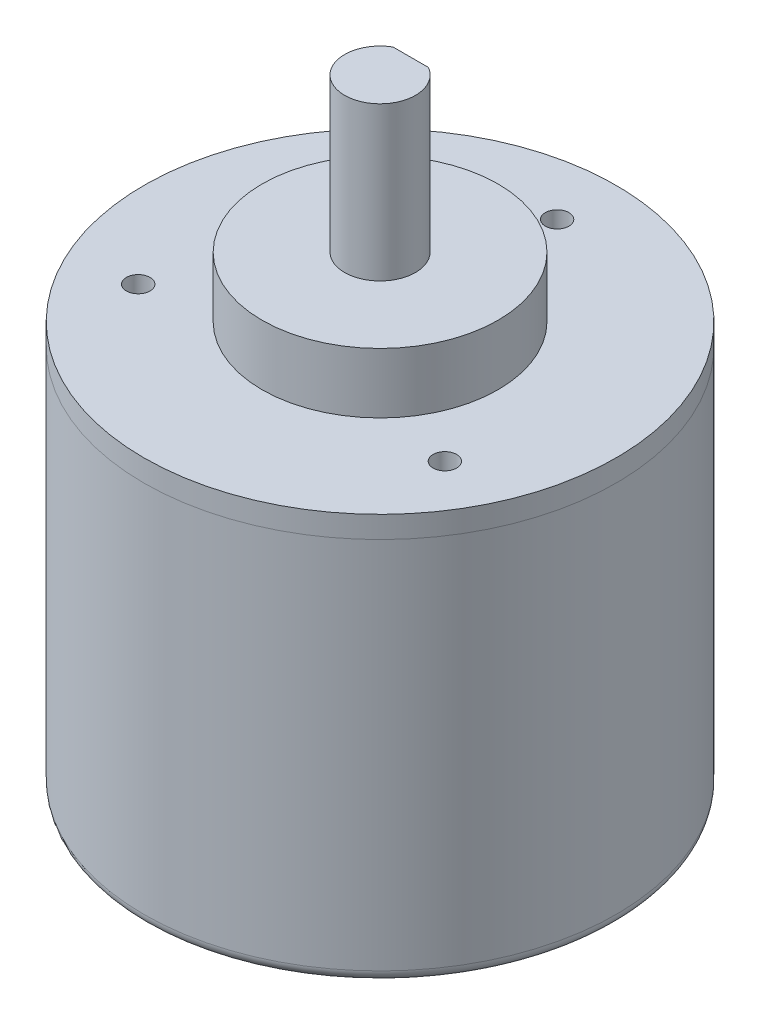
ISO-10303-21;
HEADER;
FILE_DESCRIPTION(('STEP AP214'),'2;1');
FILE_NAME('part.step','',(''),(''),'','','');
FILE_SCHEMA(('AUTOMOTIVE_DESIGN { 1 0 10303 214 1 1 1 1 }'));
ENDSEC;
DATA;
#1=APPLICATION_CONTEXT('core data for automotive mechanical design processes');
#2=APPLICATION_PROTOCOL_DEFINITION('international standard','automotive_design',2000,#1);
#3=PRODUCT_CONTEXT('',#1,'mechanical');
#4=PRODUCT('Part','Part','',(#3));
#5=PRODUCT_RELATED_PRODUCT_CATEGORY('part','',(#4));
#6=PRODUCT_DEFINITION_FORMATION('','',#4);
#7=PRODUCT_DEFINITION_CONTEXT('part definition',#1,'design');
#8=PRODUCT_DEFINITION('design','',#6,#7);
#9=PRODUCT_DEFINITION_SHAPE('','',#8);
#10=(LENGTH_UNIT() NAMED_UNIT(*) SI_UNIT(.MILLI.,.METRE.));
#11=(NAMED_UNIT(*) PLANE_ANGLE_UNIT() SI_UNIT($,.RADIAN.));
#12=(NAMED_UNIT(*) SI_UNIT($,.STERADIAN.) SOLID_ANGLE_UNIT());
#13=UNCERTAINTY_MEASURE_WITH_UNIT(LENGTH_MEASURE(1.E-05),#10,'distance_accuracy_value','');
#14=(GEOMETRIC_REPRESENTATION_CONTEXT(3) GLOBAL_UNCERTAINTY_ASSIGNED_CONTEXT((#13)) GLOBAL_UNIT_ASSIGNED_CONTEXT((#10,
#11,#12)) REPRESENTATION_CONTEXT('',''));
#15=CARTESIAN_POINT('',(0.,0.,0.));
#16=DIRECTION('',(0.,0.,1.));
#17=DIRECTION('',(1.,0.,0.));
#18=AXIS2_PLACEMENT_3D('',#15,#16,#17);
#19=CARTESIAN_POINT('',(0.,39.6,0.));
#20=DIRECTION('',(0.,1.,0.));
#21=DIRECTION('',(0.,0.,1.));
#22=AXIS2_PLACEMENT_3D('',#19,#20,#21);
#23=PLANE('',#22);
#24=CARTESIAN_POINT('',(0.,39.6,0.));
#25=DIRECTION('',(0.,1.,0.));
#26=DIRECTION('',(0.,0.,1.));
#27=AXIS2_PLACEMENT_3D('',#24,#25,#26);
#28=CIRCLE('',#27,10.);
#29=CARTESIAN_POINT('',(0.,39.6,10.));
#30=VERTEX_POINT('',#29);
#31=EDGE_CURVE('E99',#30,#30,#28,.T.);
#32=ORIENTED_EDGE('',*,*,#31,.T.);
#33=EDGE_LOOP('',(#32));
#34=FACE_BOUND('',#33,.T.);
#35=DIRECTION('',(-1.,0.,0.));
#36=VECTOR('',#35,1.);
#37=CARTESIAN_POINT('',(-1.5,39.6,-2.59807621135332));
#38=LINE('',#37,#36);
#39=CARTESIAN_POINT('',(1.5,39.6,-2.59807621135332));
#40=VERTEX_POINT('',#39);
#41=CARTESIAN_POINT('',(-1.5,39.6,-2.59807621135332));
#42=VERTEX_POINT('',#41);
#43=EDGE_CURVE('E74',#40,#42,#38,.T.);
#44=ORIENTED_EDGE('',*,*,#43,.F.);
#45=CARTESIAN_POINT('',(0.,39.6,0.));
#46=DIRECTION('',(0.,1.,0.));
#47=DIRECTION('',(0.,0.,1.));
#48=AXIS2_PLACEMENT_3D('',#45,#46,#47);
#49=CIRCLE('',#48,3.);
#50=EDGE_CURVE('E59',#42,#40,#49,.T.);
#51=ORIENTED_EDGE('',*,*,#50,.F.);
#52=EDGE_LOOP('',(#44,#51));
#53=FACE_BOUND('',#52,.T.);
#54=ADVANCED_FACE('F42',(#34,#53),#23,.T.);
#55=CARTESIAN_POINT('',(0.,34.5,0.));
#56=DIRECTION('',(0.,1.,0.));
#57=DIRECTION('',(0.,0.,1.));
#58=AXIS2_PLACEMENT_3D('',#55,#56,#57);
#59=PLANE('',#58);
#60=CARTESIAN_POINT('',(0.,34.5,-15.));
#61=DIRECTION('',(0.,1.,0.));
#62=DIRECTION('',(0.,0.,1.));
#63=AXIS2_PLACEMENT_3D('',#60,#61,#62);
#64=CIRCLE('',#63,1.);
#65=CARTESIAN_POINT('',(0.,34.5,-14.));
#66=VERTEX_POINT('',#65);
#67=EDGE_CURVE('E90',#66,#66,#64,.T.);
#68=ORIENTED_EDGE('',*,*,#67,.F.);
#69=EDGE_LOOP('',(#68));
#70=FACE_BOUND('',#69,.T.);
#71=CARTESIAN_POINT('',(12.9903810567675,34.5,7.49999999999944));
#72=DIRECTION('',(0.,1.,0.));
#73=DIRECTION('',(0.,0.,1.));
#74=AXIS2_PLACEMENT_3D('',#71,#72,#73);
#75=CIRCLE('',#74,1.00000000000082);
#76=CARTESIAN_POINT('',(12.9903810567675,34.5,8.50000000000027));
#77=VERTEX_POINT('',#76);
#78=EDGE_CURVE('E94',#77,#77,#75,.T.);
#79=ORIENTED_EDGE('',*,*,#78,.F.);
#80=EDGE_LOOP('',(#79));
#81=FACE_BOUND('',#80,.T.);
#82=CARTESIAN_POINT('',(-12.9903810567656,34.5,7.50000000000056));
#83=DIRECTION('',(0.,1.,0.));
#84=DIRECTION('',(0.,0.,1.));
#85=AXIS2_PLACEMENT_3D('',#82,#83,#84);
#86=CIRCLE('',#85,1.00000000000122);
#87=CARTESIAN_POINT('',(-12.9903810567656,34.5,8.50000000000178));
#88=VERTEX_POINT('',#87);
#89=EDGE_CURVE('E89',#88,#88,#86,.T.);
#90=ORIENTED_EDGE('',*,*,#89,.F.);
#91=EDGE_LOOP('',(#90));
#92=FACE_BOUND('',#91,.T.);
#93=CARTESIAN_POINT('',(0.,34.5,0.));
#94=DIRECTION('',(0.,1.,0.));
#95=DIRECTION('',(0.,0.,1.));
#96=AXIS2_PLACEMENT_3D('',#93,#94,#95);
#97=CIRCLE('',#96,20.);
#98=CARTESIAN_POINT('',(0.,34.5,20.));
#99=VERTEX_POINT('',#98);
#100=EDGE_CURVE('E12',#99,#99,#97,.T.);
#101=ORIENTED_EDGE('',*,*,#100,.T.);
#102=EDGE_LOOP('',(#101));
#103=FACE_BOUND('',#102,.T.);
#104=CARTESIAN_POINT('',(0.,34.5,0.));
#105=DIRECTION('',(0.,1.,0.));
#106=DIRECTION('',(0.,0.,1.));
#107=AXIS2_PLACEMENT_3D('',#104,#105,#106);
#108=CIRCLE('',#107,10.);
#109=CARTESIAN_POINT('',(0.,34.5,10.));
#110=VERTEX_POINT('',#109);
#111=EDGE_CURVE('E102',#110,#110,#108,.T.);
#112=ORIENTED_EDGE('',*,*,#111,.F.);
#113=EDGE_LOOP('',(#112));
#114=FACE_BOUND('',#113,.T.);
#115=ADVANCED_FACE('F131',(#70,#81,#92,#103,#114),#59,.T.);
#116=CARTESIAN_POINT('',(0.,34.5,0.));
#117=DIRECTION('',(0.,-1.,0.));
#118=DIRECTION('',(0.,0.,-1.));
#119=AXIS2_PLACEMENT_3D('',#116,#117,#118);
#120=CYLINDRICAL_SURFACE('',#119,20.);
#121=ORIENTED_EDGE('',*,*,#100,.F.);
#122=EDGE_LOOP('',(#121));
#123=FACE_BOUND('',#122,.T.);
#124=CARTESIAN_POINT('',(0.,32.65,0.));
#125=DIRECTION('',(0.,1.,0.));
#126=DIRECTION('',(0.,0.,1.));
#127=AXIS2_PLACEMENT_3D('',#124,#125,#126);
#128=CIRCLE('',#127,20.);
#129=CARTESIAN_POINT('',(0.,32.65,20.));
#130=VERTEX_POINT('',#129);
#131=EDGE_CURVE('E51',#130,#130,#128,.T.);
#132=ORIENTED_EDGE('',*,*,#131,.T.);
#133=EDGE_LOOP('',(#132));
#134=FACE_BOUND('',#133,.T.);
#135=ADVANCED_FACE('F44',(#123,#134),#120,.T.);
#136=CARTESIAN_POINT('',(0.,32.65,0.));
#137=DIRECTION('',(0.,1.,0.));
#138=DIRECTION('',(0.,0.,1.));
#139=AXIS2_PLACEMENT_3D('',#136,#137,#138);
#140=PLANE('',#139);
#141=CARTESIAN_POINT('',(0.,32.65,-15.));
#142=DIRECTION('',(0.,1.,0.));
#143=DIRECTION('',(0.,0.,1.));
#144=AXIS2_PLACEMENT_3D('',#141,#142,#143);
#145=CIRCLE('',#144,1.);
#146=CARTESIAN_POINT('',(0.,32.65,-14.));
#147=VERTEX_POINT('',#146);
#148=EDGE_CURVE('E46',#147,#147,#145,.T.);
#149=ORIENTED_EDGE('',*,*,#148,.T.);
#150=EDGE_LOOP('',(#149));
#151=FACE_BOUND('',#150,.T.);
#152=CARTESIAN_POINT('',(12.9903810567675,32.65,7.49999999999944));
#153=DIRECTION('',(0.,1.,0.));
#154=DIRECTION('',(0.,0.,1.));
#155=AXIS2_PLACEMENT_3D('',#152,#153,#154);
#156=CIRCLE('',#155,1.00000000000082);
#157=CARTESIAN_POINT('',(12.9903810567675,32.65,8.50000000000027));
#158=VERTEX_POINT('',#157);
#159=EDGE_CURVE('E108',#158,#158,#156,.T.);
#160=ORIENTED_EDGE('',*,*,#159,.T.);
#161=EDGE_LOOP('',(#160));
#162=FACE_BOUND('',#161,.T.);
#163=CARTESIAN_POINT('',(-12.9903810567656,32.65,7.50000000000056));
#164=DIRECTION('',(0.,1.,0.));
#165=DIRECTION('',(0.,0.,1.));
#166=AXIS2_PLACEMENT_3D('',#163,#164,#165);
#167=CIRCLE('',#166,1.00000000000122);
#168=CARTESIAN_POINT('',(-12.9903810567656,32.65,8.50000000000178));
#169=VERTEX_POINT('',#168);
#170=EDGE_CURVE('E93',#169,#169,#167,.T.);
#171=ORIENTED_EDGE('',*,*,#170,.T.);
#172=EDGE_LOOP('',(#171));
#173=FACE_BOUND('',#172,.T.);
#174=ORIENTED_EDGE('',*,*,#131,.F.);
#175=EDGE_LOOP('',(#174));
#176=FACE_BOUND('',#175,.T.);
#177=ADVANCED_FACE('F115',(#151,#162,#173,#176),#140,.F.);
#178=CARTESIAN_POINT('',(0.,39.6,0.));
#179=DIRECTION('',(0.,-1.,0.));
#180=DIRECTION('',(0.,0.,-1.));
#181=AXIS2_PLACEMENT_3D('',#178,#179,#180);
#182=CYLINDRICAL_SURFACE('',#181,10.);
#183=ORIENTED_EDGE('',*,*,#31,.F.);
#184=EDGE_LOOP('',(#183));
#185=FACE_BOUND('',#184,.T.);
#186=ORIENTED_EDGE('',*,*,#111,.T.);
#187=EDGE_LOOP('',(#186));
#188=FACE_BOUND('',#187,.T.);
#189=ADVANCED_FACE('F141',(#185,#188),#182,.T.);
#190=CARTESIAN_POINT('',(-12.9903810567656,24.5,7.50000000000056));
#191=DIRECTION('',(0.,1.,0.));
#192=DIRECTION('',(0.,0.,1.));
#193=AXIS2_PLACEMENT_3D('',#190,#191,#192);
#194=CYLINDRICAL_SURFACE('',#193,1.00000000000122);
#195=ORIENTED_EDGE('',*,*,#89,.T.);
#196=EDGE_LOOP('',(#195));
#197=FACE_BOUND('',#196,.T.);
#198=ORIENTED_EDGE('',*,*,#170,.F.);
#199=EDGE_LOOP('',(#198));
#200=FACE_BOUND('',#199,.T.);
#201=ADVANCED_FACE('F127',(#197,#200),#194,.F.);
#202=CARTESIAN_POINT('',(12.9903810567675,24.5,7.49999999999944));
#203=DIRECTION('',(0.,1.,0.));
#204=DIRECTION('',(0.,0.,1.));
#205=AXIS2_PLACEMENT_3D('',#202,#203,#204);
#206=CYLINDRICAL_SURFACE('',#205,1.00000000000082);
#207=ORIENTED_EDGE('',*,*,#78,.T.);
#208=EDGE_LOOP('',(#207));
#209=FACE_BOUND('',#208,.T.);
#210=ORIENTED_EDGE('',*,*,#159,.F.);
#211=EDGE_LOOP('',(#210));
#212=FACE_BOUND('',#211,.T.);
#213=ADVANCED_FACE('F119',(#209,#212),#206,.F.);
#214=CARTESIAN_POINT('',(0.,24.5,-15.));
#215=DIRECTION('',(0.,1.,0.));
#216=DIRECTION('',(0.,0.,1.));
#217=AXIS2_PLACEMENT_3D('',#214,#215,#216);
#218=CYLINDRICAL_SURFACE('',#217,1.);
#219=ORIENTED_EDGE('',*,*,#67,.T.);
#220=EDGE_LOOP('',(#219));
#221=FACE_BOUND('',#220,.T.);
#222=ORIENTED_EDGE('',*,*,#148,.F.);
#223=EDGE_LOOP('',(#222));
#224=FACE_BOUND('',#223,.T.);
#225=ADVANCED_FACE('F117',(#221,#224),#218,.F.);
#226=CARTESIAN_POINT('',(0.,52.6,0.));
#227=DIRECTION('',(0.,-1.,0.));
#228=DIRECTION('',(0.,0.,-1.));
#229=AXIS2_PLACEMENT_3D('',#226,#227,#228);
#230=CYLINDRICAL_SURFACE('',#229,3.);
#231=ORIENTED_EDGE('',*,*,#50,.T.);
#232=DIRECTION('',(0.,-1.,0.));
#233=VECTOR('',#232,1.);
#234=CARTESIAN_POINT('',(1.5,52.6,-2.59807621135332));
#235=LINE('',#234,#233);
#236=CARTESIAN_POINT('',(1.5,52.6,-2.59807621135332));
#237=VERTEX_POINT('',#236);
#238=EDGE_CURVE('E78',#237,#40,#235,.T.);
#239=ORIENTED_EDGE('',*,*,#238,.F.);
#240=CARTESIAN_POINT('',(0.,52.6,0.));
#241=DIRECTION('',(0.,1.,0.));
#242=DIRECTION('',(0.,0.,1.));
#243=AXIS2_PLACEMENT_3D('',#240,#241,#242);
#244=CIRCLE('',#243,3.);
#245=CARTESIAN_POINT('',(-1.5,52.6,-2.59807621135332));
#246=VERTEX_POINT('',#245);
#247=EDGE_CURVE('E80',#246,#237,#244,.T.);
#248=ORIENTED_EDGE('',*,*,#247,.F.);
#249=DIRECTION('',(0.,-1.,0.));
#250=VECTOR('',#249,1.);
#251=CARTESIAN_POINT('',(-1.5,52.6,-2.59807621135332));
#252=LINE('',#251,#250);
#253=EDGE_CURVE('E76',#246,#42,#252,.T.);
#254=ORIENTED_EDGE('',*,*,#253,.T.);
#255=EDGE_LOOP('',(#231,#239,#248,#254));
#256=FACE_BOUND('',#255,.T.);
#257=ADVANCED_FACE('F82',(#256),#230,.T.);
#258=CARTESIAN_POINT('',(-1.5,52.6,-2.59807621135332));
#259=DIRECTION('',(0.,0.,1.));
#260=DIRECTION('',(1.,0.,0.));
#261=AXIS2_PLACEMENT_3D('',#258,#259,#260);
#262=PLANE('',#261);
#263=ORIENTED_EDGE('',*,*,#43,.T.);
#264=ORIENTED_EDGE('',*,*,#253,.F.);
#265=DIRECTION('',(-1.,0.,0.));
#266=VECTOR('',#265,1.);
#267=CARTESIAN_POINT('',(-1.5,52.6,-2.59807621135332));
#268=LINE('',#267,#266);
#269=EDGE_CURVE('E67',#237,#246,#268,.T.);
#270=ORIENTED_EDGE('',*,*,#269,.F.);
#271=ORIENTED_EDGE('',*,*,#238,.T.);
#272=EDGE_LOOP('',(#263,#264,#270,#271));
#273=FACE_BOUND('',#272,.T.);
#274=ADVANCED_FACE('F75',(#273),#262,.F.);
#275=CARTESIAN_POINT('',(0.,52.6,0.));
#276=DIRECTION('',(0.,1.,0.));
#277=DIRECTION('',(0.,0.,1.));
#278=AXIS2_PLACEMENT_3D('',#275,#276,#277);
#279=PLANE('',#278);
#280=ORIENTED_EDGE('',*,*,#247,.T.);
#281=ORIENTED_EDGE('',*,*,#269,.T.);
#282=EDGE_LOOP('',(#280,#281));
#283=FACE_BOUND('',#282,.T.);
#284=ADVANCED_FACE('F207',(#283),#279,.T.);
#285=CLOSED_SHELL('',(#54,#115,#135,#177,#189,#201,#213,#225,#257,#274,#284));
#286=MANIFOLD_SOLID_BREP('B2',#285);
#287=CARTESIAN_POINT('',(0.,32.65,0.));
#288=DIRECTION('',(0.,-1.,0.));
#289=DIRECTION('',(0.,0.,-1.));
#290=AXIS2_PLACEMENT_3D('',#287,#288,#289);
#291=CYLINDRICAL_SURFACE('',#290,20.);
#292=CARTESIAN_POINT('',(0.,1.,0.));
#293=DIRECTION('',(0.,1.,0.));
#294=DIRECTION('',(0.,0.,1.));
#295=AXIS2_PLACEMENT_3D('',#292,#293,#294);
#296=CIRCLE('',#295,20.);
#297=CARTESIAN_POINT('',(0.,1.,20.));
#298=VERTEX_POINT('',#297);
#299=EDGE_CURVE('E243',#298,#298,#296,.T.);
#300=ORIENTED_EDGE('',*,*,#299,.T.);
#301=EDGE_LOOP('',(#300));
#302=FACE_BOUND('',#301,.T.);
#303=CARTESIAN_POINT('',(0.,32.65,0.));
#304=DIRECTION('',(0.,1.,0.));
#305=DIRECTION('',(0.,0.,1.));
#306=AXIS2_PLACEMENT_3D('',#303,#304,#305);
#307=CIRCLE('',#306,20.);
#308=CARTESIAN_POINT('',(0.,32.65,20.));
#309=VERTEX_POINT('',#308);
#310=EDGE_CURVE('E247',#309,#309,#307,.T.);
#311=ORIENTED_EDGE('',*,*,#310,.F.);
#312=EDGE_LOOP('',(#311));
#313=FACE_BOUND('',#312,.T.);
#314=ADVANCED_FACE('F236',(#302,#313),#291,.T.);
#315=CARTESIAN_POINT('',(0.,32.65,0.));
#316=DIRECTION('',(0.,1.,0.));
#317=DIRECTION('',(0.,0.,1.));
#318=AXIS2_PLACEMENT_3D('',#315,#316,#317);
#319=PLANE('',#318);
#320=CARTESIAN_POINT('',(0.,32.65,-15.));
#321=DIRECTION('',(0.,1.,0.));
#322=DIRECTION('',(0.,0.,1.));
#323=AXIS2_PLACEMENT_3D('',#320,#321,#322);
#324=CIRCLE('',#323,1.);
#325=CARTESIAN_POINT('',(0.,32.65,-14.));
#326=VERTEX_POINT('',#325);
#327=EDGE_CURVE('E251',#326,#326,#324,.T.);
#328=ORIENTED_EDGE('',*,*,#327,.F.);
#329=EDGE_LOOP('',(#328));
#330=FACE_BOUND('',#329,.T.);
#331=CARTESIAN_POINT('',(12.9903810567675,32.65,7.49999999999944));
#332=DIRECTION('',(0.,1.,0.));
#333=DIRECTION('',(0.,0.,1.));
#334=AXIS2_PLACEMENT_3D('',#331,#332,#333);
#335=CIRCLE('',#334,1.00000000000082);
#336=CARTESIAN_POINT('',(12.9903810567675,32.65,8.50000000000027));
#337=VERTEX_POINT('',#336);
#338=EDGE_CURVE('E256',#337,#337,#335,.T.);
#339=ORIENTED_EDGE('',*,*,#338,.F.);
#340=EDGE_LOOP('',(#339));
#341=FACE_BOUND('',#340,.T.);
#342=CARTESIAN_POINT('',(-12.9903810567656,32.65,7.50000000000056));
#343=DIRECTION('',(0.,1.,0.));
#344=DIRECTION('',(0.,0.,1.));
#345=AXIS2_PLACEMENT_3D('',#342,#343,#344);
#346=CIRCLE('',#345,1.00000000000122);
#347=CARTESIAN_POINT('',(-12.9903810567656,32.65,8.50000000000178));
#348=VERTEX_POINT('',#347);
#349=EDGE_CURVE('E259',#348,#348,#346,.T.);
#350=ORIENTED_EDGE('',*,*,#349,.F.);
#351=EDGE_LOOP('',(#350));
#352=FACE_BOUND('',#351,.T.);
#353=ORIENTED_EDGE('',*,*,#310,.T.);
#354=EDGE_LOOP('',(#353));
#355=FACE_BOUND('',#354,.T.);
#356=ADVANCED_FACE('F288',(#330,#341,#352,#355),#319,.T.);
#357=CARTESIAN_POINT('',(0.,0.,0.));
#358=DIRECTION('',(0.,1.,0.));
#359=DIRECTION('',(0.,0.,1.));
#360=AXIS2_PLACEMENT_3D('',#357,#358,#359);
#361=PLANE('',#360);
#362=CARTESIAN_POINT('',(0.,0.,0.));
#363=DIRECTION('',(0.,1.,0.));
#364=DIRECTION('',(0.,0.,1.));
#365=AXIS2_PLACEMENT_3D('',#362,#363,#364);
#366=CIRCLE('',#365,19.);
#367=CARTESIAN_POINT('',(0.,0.,19.));
#368=VERTEX_POINT('',#367);
#369=EDGE_CURVE('E41',#368,#368,#366,.F.);
#370=ORIENTED_EDGE('',*,*,#369,.T.);
#371=EDGE_LOOP('',(#370));
#372=FACE_BOUND('',#371,.T.);
#373=ADVANCED_FACE('F292',(#372),#361,.F.);
#374=CARTESIAN_POINT('',(-12.9903810567656,24.5,7.50000000000056));
#375=DIRECTION('',(0.,1.,0.));
#376=DIRECTION('',(0.,0.,1.));
#377=AXIS2_PLACEMENT_3D('',#374,#375,#376);
#378=CYLINDRICAL_SURFACE('',#377,1.00000000000122);
#379=ORIENTED_EDGE('',*,*,#349,.T.);
#380=EDGE_LOOP('',(#379));
#381=FACE_BOUND('',#380,.T.);
#382=CARTESIAN_POINT('',(-12.9903810567656,24.5,7.50000000000056));
#383=DIRECTION('',(0.,1.,0.));
#384=DIRECTION('',(0.,0.,1.));
#385=AXIS2_PLACEMENT_3D('',#382,#383,#384);
#386=CIRCLE('',#385,1.00000000000122);
#387=CARTESIAN_POINT('',(-12.9903810567656,24.5,8.50000000000178));
#388=VERTEX_POINT('',#387);
#389=EDGE_CURVE('E263',#388,#388,#386,.T.);
#390=ORIENTED_EDGE('',*,*,#389,.F.);
#391=EDGE_LOOP('',(#390));
#392=FACE_BOUND('',#391,.T.);
#393=ADVANCED_FACE('F298',(#381,#392),#378,.F.);
#394=CARTESIAN_POINT('',(-12.9903810567656,24.5,7.50000000000056));
#395=DIRECTION('',(0.,1.,0.));
#396=DIRECTION('',(0.,0.,1.));
#397=AXIS2_PLACEMENT_3D('',#394,#395,#396);
#398=PLANE('',#397);
#399=ORIENTED_EDGE('',*,*,#389,.T.);
#400=EDGE_LOOP('',(#399));
#401=FACE_BOUND('',#400,.T.);
#402=ADVANCED_FACE('F302',(#401),#398,.T.);
#403=CARTESIAN_POINT('',(12.9903810567675,24.5,7.49999999999944));
#404=DIRECTION('',(0.,1.,0.));
#405=DIRECTION('',(0.,0.,1.));
#406=AXIS2_PLACEMENT_3D('',#403,#404,#405);
#407=CYLINDRICAL_SURFACE('',#406,1.00000000000082);
#408=ORIENTED_EDGE('',*,*,#338,.T.);
#409=EDGE_LOOP('',(#408));
#410=FACE_BOUND('',#409,.T.);
#411=CARTESIAN_POINT('',(12.9903810567675,24.5,7.49999999999944));
#412=DIRECTION('',(0.,1.,0.));
#413=DIRECTION('',(0.,0.,1.));
#414=AXIS2_PLACEMENT_3D('',#411,#412,#413);
#415=CIRCLE('',#414,1.00000000000082);
#416=CARTESIAN_POINT('',(12.9903810567675,24.5,8.50000000000027));
#417=VERTEX_POINT('',#416);
#418=EDGE_CURVE('E266',#417,#417,#415,.T.);
#419=ORIENTED_EDGE('',*,*,#418,.F.);
#420=EDGE_LOOP('',(#419));
#421=FACE_BOUND('',#420,.T.);
#422=ADVANCED_FACE('F284',(#410,#421),#407,.F.);
#423=CARTESIAN_POINT('',(12.9903810567675,24.5,7.49999999999944));
#424=DIRECTION('',(0.,1.,0.));
#425=DIRECTION('',(0.,0.,1.));
#426=AXIS2_PLACEMENT_3D('',#423,#424,#425);
#427=PLANE('',#426);
#428=ORIENTED_EDGE('',*,*,#418,.T.);
#429=EDGE_LOOP('',(#428));
#430=FACE_BOUND('',#429,.T.);
#431=ADVANCED_FACE('F276',(#430),#427,.T.);
#432=CARTESIAN_POINT('',(0.,24.5,-15.));
#433=DIRECTION('',(0.,1.,0.));
#434=DIRECTION('',(0.,0.,1.));
#435=AXIS2_PLACEMENT_3D('',#432,#433,#434);
#436=CYLINDRICAL_SURFACE('',#435,1.);
#437=ORIENTED_EDGE('',*,*,#327,.T.);
#438=EDGE_LOOP('',(#437));
#439=FACE_BOUND('',#438,.T.);
#440=CARTESIAN_POINT('',(0.,24.5,-15.));
#441=DIRECTION('',(0.,1.,0.));
#442=DIRECTION('',(0.,0.,1.));
#443=AXIS2_PLACEMENT_3D('',#440,#441,#442);
#444=CIRCLE('',#443,1.);
#445=CARTESIAN_POINT('',(0.,24.5,-14.));
#446=VERTEX_POINT('',#445);
#447=EDGE_CURVE('E261',#446,#446,#444,.T.);
#448=ORIENTED_EDGE('',*,*,#447,.F.);
#449=EDGE_LOOP('',(#448));
#450=FACE_BOUND('',#449,.T.);
#451=ADVANCED_FACE('F274',(#439,#450),#436,.F.);
#452=CARTESIAN_POINT('',(0.,24.5,-15.));
#453=DIRECTION('',(0.,1.,0.));
#454=DIRECTION('',(0.,0.,1.));
#455=AXIS2_PLACEMENT_3D('',#452,#453,#454);
#456=PLANE('',#455);
#457=ORIENTED_EDGE('',*,*,#447,.T.);
#458=EDGE_LOOP('',(#457));
#459=FACE_BOUND('',#458,.T.);
#460=ADVANCED_FACE('F272',(#459),#456,.T.);
#461=CARTESIAN_POINT('',(0.,1.,0.));
#462=DIRECTION('',(0.,1.,0.));
#463=DIRECTION('',(0.,0.,1.));
#464=AXIS2_PLACEMENT_3D('',#461,#462,#463);
#465=TOROIDAL_SURFACE('',#464,19.,1.);
#466=ORIENTED_EDGE('',*,*,#369,.F.);
#467=EDGE_LOOP('',(#466));
#468=FACE_BOUND('',#467,.T.);
#469=ORIENTED_EDGE('',*,*,#299,.F.);
#470=EDGE_LOOP('',(#469));
#471=FACE_BOUND('',#470,.T.);
#472=ADVANCED_FACE('F238',(#468,#471),#465,.T.);
#473=CLOSED_SHELL('',(#314,#356,#373,#393,#402,#422,#431,#451,#460,#472));
#474=MANIFOLD_SOLID_BREP('B6',#473);
#475=ADVANCED_BREP_SHAPE_REPRESENTATION('',(#18,#286,#474),#14);
#476=SHAPE_DEFINITION_REPRESENTATION(#9,#475);
ENDSEC;
END-ISO-10303-21;
